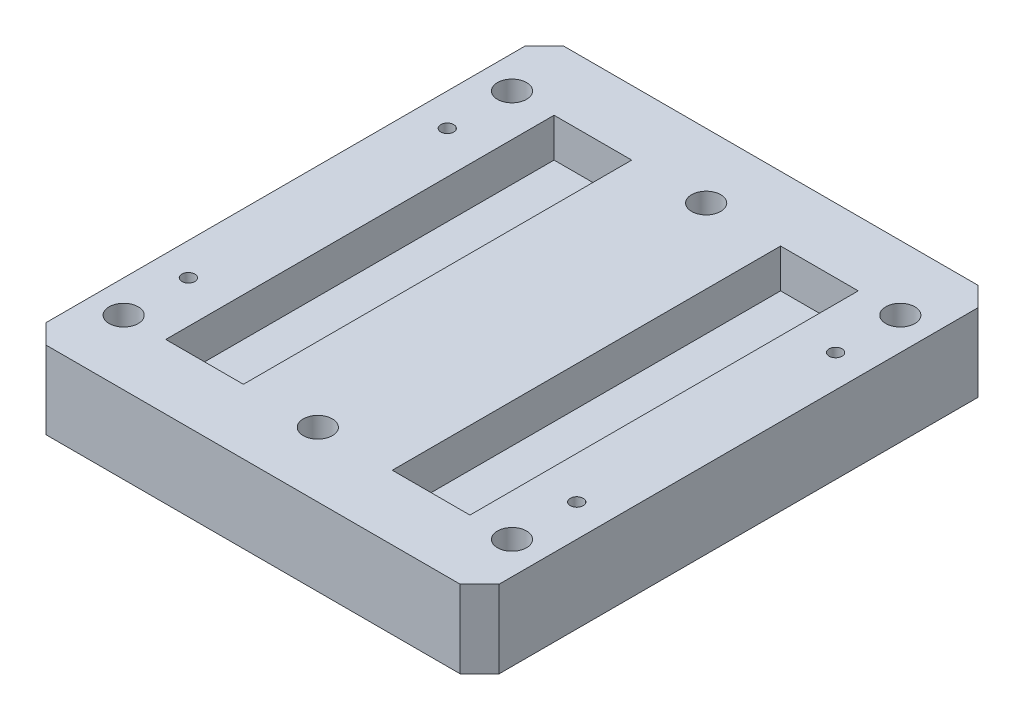
ISO-10303-21;
HEADER;
FILE_DESCRIPTION(('STEP AP214'),'2;1');
FILE_NAME('part.step','',(''),(''),'','','');
FILE_SCHEMA(('AUTOMOTIVE_DESIGN { 1 0 10303 214 1 1 1 1 }'));
ENDSEC;
DATA;
#1=APPLICATION_CONTEXT('core data for automotive mechanical design processes');
#2=APPLICATION_PROTOCOL_DEFINITION('international standard','automotive_design',2000,#1);
#3=PRODUCT_CONTEXT('',#1,'mechanical');
#4=PRODUCT('Part','Part','',(#3));
#5=PRODUCT_RELATED_PRODUCT_CATEGORY('part','',(#4));
#6=PRODUCT_DEFINITION_FORMATION('','',#4);
#7=PRODUCT_DEFINITION_CONTEXT('part definition',#1,'design');
#8=PRODUCT_DEFINITION('design','',#6,#7);
#9=PRODUCT_DEFINITION_SHAPE('','',#8);
#10=(LENGTH_UNIT() NAMED_UNIT(*) SI_UNIT(.MILLI.,.METRE.));
#11=(NAMED_UNIT(*) PLANE_ANGLE_UNIT() SI_UNIT($,.RADIAN.));
#12=(NAMED_UNIT(*) SI_UNIT($,.STERADIAN.) SOLID_ANGLE_UNIT());
#13=UNCERTAINTY_MEASURE_WITH_UNIT(LENGTH_MEASURE(1.E-05),#10,'distance_accuracy_value','');
#14=(GEOMETRIC_REPRESENTATION_CONTEXT(3) GLOBAL_UNCERTAINTY_ASSIGNED_CONTEXT((#13)) GLOBAL_UNIT_ASSIGNED_CONTEXT((#10,
#11,#12)) REPRESENTATION_CONTEXT('',''));
#15=CARTESIAN_POINT('',(0.,0.,0.));
#16=DIRECTION('',(0.,0.,1.));
#17=DIRECTION('',(1.,0.,0.));
#18=AXIS2_PLACEMENT_3D('',#15,#16,#17);
#19=CARTESIAN_POINT('',(0.,0.,80.));
#20=DIRECTION('',(1.,0.,0.));
#21=DIRECTION('',(0.,0.,-1.));
#22=AXIS2_PLACEMENT_3D('',#19,#20,#21);
#23=PLANE('',#22);
#24=DIRECTION('',(0.,0.,-1.));
#25=VECTOR('',#24,1.);
#26=CARTESIAN_POINT('',(0.,12.,80.));
#27=LINE('',#26,#25);
#28=CARTESIAN_POINT('',(0.,12.,77.));
#29=VERTEX_POINT('',#28);
#30=CARTESIAN_POINT('',(0.,12.,3.));
#31=VERTEX_POINT('',#30);
#32=EDGE_CURVE('E271',#29,#31,#27,.T.);
#33=ORIENTED_EDGE('',*,*,#32,.T.);
#34=DIRECTION('',(0.,-1.,0.));
#35=VECTOR('',#34,1.);
#36=CARTESIAN_POINT('',(0.,0.,3.));
#37=LINE('',#36,#35);
#38=CARTESIAN_POINT('',(0.,0.,3.));
#39=VERTEX_POINT('',#38);
#40=EDGE_CURVE('E288',#31,#39,#37,.T.);
#41=ORIENTED_EDGE('',*,*,#40,.T.);
#42=DIRECTION('',(0.,0.,-1.));
#43=VECTOR('',#42,1.);
#44=CARTESIAN_POINT('',(0.,0.,80.));
#45=LINE('',#44,#43);
#46=CARTESIAN_POINT('',(0.,0.,77.));
#47=VERTEX_POINT('',#46);
#48=EDGE_CURVE('E283',#47,#39,#45,.T.);
#49=ORIENTED_EDGE('',*,*,#48,.F.);
#50=DIRECTION('',(0.,1.,0.));
#51=VECTOR('',#50,1.);
#52=CARTESIAN_POINT('',(0.,0.,77.));
#53=LINE('',#52,#51);
#54=EDGE_CURVE('E286',#47,#29,#53,.T.);
#55=ORIENTED_EDGE('',*,*,#54,.T.);
#56=EDGE_LOOP('',(#33,#41,#49,#55));
#57=FACE_BOUND('',#56,.T.);
#58=ADVANCED_FACE('F33',(#57),#23,.F.);
#59=CARTESIAN_POINT('',(0.,0.,80.));
#60=DIRECTION('',(0.,1.,0.));
#61=DIRECTION('',(0.,0.,1.));
#62=AXIS2_PLACEMENT_3D('',#59,#60,#61);
#63=PLANE('',#62);
#64=CARTESIAN_POINT('',(65.,0.,20.));
#65=DIRECTION('',(0.,1.,0.));
#66=DIRECTION('',(0.,0.,-1.));
#67=AXIS2_PLACEMENT_3D('',#64,#65,#66);
#68=CIRCLE('',#67,0.999999999999998);
#69=CARTESIAN_POINT('',(65.,0.,19.));
#70=VERTEX_POINT('',#69);
#71=EDGE_CURVE('E574',#70,#70,#68,.T.);
#72=ORIENTED_EDGE('',*,*,#71,.T.);
#73=EDGE_LOOP('',(#72));
#74=FACE_BOUND('',#73,.T.);
#75=CARTESIAN_POINT('',(65.,0.,60.));
#76=DIRECTION('',(0.,1.,0.));
#77=DIRECTION('',(0.,0.,1.));
#78=AXIS2_PLACEMENT_3D('',#75,#76,#77);
#79=CIRCLE('',#78,0.999999999999998);
#80=CARTESIAN_POINT('',(65.,0.,61.));
#81=VERTEX_POINT('',#80);
#82=EDGE_CURVE('E582',#81,#81,#79,.T.);
#83=ORIENTED_EDGE('',*,*,#82,.T.);
#84=EDGE_LOOP('',(#83));
#85=FACE_BOUND('',#84,.T.);
#86=CARTESIAN_POINT('',(5.,0.,60.));
#87=DIRECTION('',(0.,1.,0.));
#88=DIRECTION('',(0.,0.,-1.));
#89=AXIS2_PLACEMENT_3D('',#86,#87,#88);
#90=CIRCLE('',#89,1.);
#91=CARTESIAN_POINT('',(5.,0.,59.));
#92=VERTEX_POINT('',#91);
#93=EDGE_CURVE('E588',#92,#92,#90,.T.);
#94=ORIENTED_EDGE('',*,*,#93,.T.);
#95=EDGE_LOOP('',(#94));
#96=FACE_BOUND('',#95,.T.);
#97=CARTESIAN_POINT('',(5.,0.,20.));
#98=DIRECTION('',(0.,1.,0.));
#99=DIRECTION('',(0.,0.,1.));
#100=AXIS2_PLACEMENT_3D('',#97,#98,#99);
#101=CIRCLE('',#100,1.);
#102=CARTESIAN_POINT('',(5.,0.,21.));
#103=VERTEX_POINT('',#102);
#104=EDGE_CURVE('E173',#103,#103,#101,.T.);
#105=ORIENTED_EDGE('',*,*,#104,.T.);
#106=EDGE_LOOP('',(#105));
#107=FACE_BOUND('',#106,.T.);
#108=CARTESIAN_POINT('',(35.,0.,70.));
#109=DIRECTION('',(0.,1.,0.));
#110=DIRECTION('',(0.,0.,1.));
#111=AXIS2_PLACEMENT_3D('',#108,#109,#110);
#112=CIRCLE('',#111,2.25);
#113=CARTESIAN_POINT('',(35.,0.,72.25));
#114=VERTEX_POINT('',#113);
#115=EDGE_CURVE('E216',#114,#114,#112,.T.);
#116=ORIENTED_EDGE('',*,*,#115,.T.);
#117=EDGE_LOOP('',(#116));
#118=FACE_BOUND('',#117,.T.);
#119=CARTESIAN_POINT('',(35.,0.,10.));
#120=DIRECTION('',(0.,1.,0.));
#121=DIRECTION('',(0.,0.,1.));
#122=AXIS2_PLACEMENT_3D('',#119,#120,#121);
#123=CIRCLE('',#122,2.25);
#124=CARTESIAN_POINT('',(35.,0.,12.25));
#125=VERTEX_POINT('',#124);
#126=EDGE_CURVE('E222',#125,#125,#123,.T.);
#127=ORIENTED_EDGE('',*,*,#126,.T.);
#128=EDGE_LOOP('',(#127));
#129=FACE_BOUND('',#128,.T.);
#130=CARTESIAN_POINT('',(5.,0.,70.));
#131=DIRECTION('',(0.,1.,0.));
#132=DIRECTION('',(0.,0.,-1.));
#133=AXIS2_PLACEMENT_3D('',#130,#131,#132);
#134=CIRCLE('',#133,2.25);
#135=CARTESIAN_POINT('',(5.,0.,67.75));
#136=VERTEX_POINT('',#135);
#137=EDGE_CURVE('E228',#136,#136,#134,.T.);
#138=ORIENTED_EDGE('',*,*,#137,.T.);
#139=EDGE_LOOP('',(#138));
#140=FACE_BOUND('',#139,.T.);
#141=CARTESIAN_POINT('',(65.,0.,10.));
#142=DIRECTION('',(0.,1.,0.));
#143=DIRECTION('',(0.,0.,-1.));
#144=AXIS2_PLACEMENT_3D('',#141,#142,#143);
#145=CIRCLE('',#144,2.25);
#146=CARTESIAN_POINT('',(65.,0.,7.75000000000001));
#147=VERTEX_POINT('',#146);
#148=EDGE_CURVE('E234',#147,#147,#145,.T.);
#149=ORIENTED_EDGE('',*,*,#148,.T.);
#150=EDGE_LOOP('',(#149));
#151=FACE_BOUND('',#150,.T.);
#152=CARTESIAN_POINT('',(65.,0.,70.));
#153=DIRECTION('',(0.,1.,0.));
#154=DIRECTION('',(0.,0.,1.));
#155=AXIS2_PLACEMENT_3D('',#152,#153,#154);
#156=CIRCLE('',#155,2.25);
#157=CARTESIAN_POINT('',(65.,0.,72.25));
#158=VERTEX_POINT('',#157);
#159=EDGE_CURVE('E240',#158,#158,#156,.T.);
#160=ORIENTED_EDGE('',*,*,#159,.T.);
#161=EDGE_LOOP('',(#160));
#162=FACE_BOUND('',#161,.T.);
#163=CARTESIAN_POINT('',(5.,0.,10.));
#164=DIRECTION('',(0.,1.,0.));
#165=DIRECTION('',(0.,0.,1.));
#166=AXIS2_PLACEMENT_3D('',#163,#164,#165);
#167=CIRCLE('',#166,2.25);
#168=CARTESIAN_POINT('',(5.,0.,12.25));
#169=VERTEX_POINT('',#168);
#170=EDGE_CURVE('E246',#169,#169,#167,.T.);
#171=ORIENTED_EDGE('',*,*,#170,.T.);
#172=EDGE_LOOP('',(#171));
#173=FACE_BOUND('',#172,.T.);
#174=ORIENTED_EDGE('',*,*,#48,.T.);
#175=DIRECTION('',(0.707106781186549,0.,-0.707106781186546));
#176=VECTOR('',#175,1.);
#177=CARTESIAN_POINT('',(0.,0.,3.));
#178=LINE('',#177,#176);
#179=CARTESIAN_POINT('',(3.00000000000002,0.,0.));
#180=VERTEX_POINT('',#179);
#181=EDGE_CURVE('E297',#39,#180,#178,.T.);
#182=ORIENTED_EDGE('',*,*,#181,.T.);
#183=DIRECTION('',(1.,0.,0.));
#184=VECTOR('',#183,1.);
#185=CARTESIAN_POINT('',(0.,0.,0.));
#186=LINE('',#185,#184);
#187=CARTESIAN_POINT('',(67.,0.,0.));
#188=VERTEX_POINT('',#187);
#189=EDGE_CURVE('E261',#180,#188,#186,.T.);
#190=ORIENTED_EDGE('',*,*,#189,.T.);
#191=DIRECTION('',(0.707106781186549,0.,0.707106781186546));
#192=VECTOR('',#191,1.);
#193=CARTESIAN_POINT('',(70.,0.,3.));
#194=LINE('',#193,#192);
#195=CARTESIAN_POINT('',(70.,0.,3.));
#196=VERTEX_POINT('',#195);
#197=EDGE_CURVE('E295',#188,#196,#194,.T.);
#198=ORIENTED_EDGE('',*,*,#197,.T.);
#199=DIRECTION('',(0.,0.,-1.));
#200=VECTOR('',#199,1.);
#201=CARTESIAN_POINT('',(70.,0.,80.));
#202=LINE('',#201,#200);
#203=CARTESIAN_POINT('',(70.,0.,77.));
#204=VERTEX_POINT('',#203);
#205=EDGE_CURVE('E280',#204,#196,#202,.T.);
#206=ORIENTED_EDGE('',*,*,#205,.F.);
#207=DIRECTION('',(0.707106781186546,0.,-0.707106781186549));
#208=VECTOR('',#207,1.);
#209=CARTESIAN_POINT('',(67.,0.,80.));
#210=LINE('',#209,#208);
#211=CARTESIAN_POINT('',(67.,0.,80.));
#212=VERTEX_POINT('',#211);
#213=EDGE_CURVE('E293',#204,#212,#210,.F.);
#214=ORIENTED_EDGE('',*,*,#213,.T.);
#215=DIRECTION('',(1.,0.,0.));
#216=VECTOR('',#215,1.);
#217=CARTESIAN_POINT('',(0.,0.,80.));
#218=LINE('',#217,#216);
#219=CARTESIAN_POINT('',(3.,0.,80.));
#220=VERTEX_POINT('',#219);
#221=EDGE_CURVE('E264',#220,#212,#218,.T.);
#222=ORIENTED_EDGE('',*,*,#221,.F.);
#223=DIRECTION('',(0.707106781186546,0.,0.707106781186549));
#224=VECTOR('',#223,1.);
#225=CARTESIAN_POINT('',(3.,0.,80.));
#226=LINE('',#225,#224);
#227=EDGE_CURVE('E291',#220,#47,#226,.F.);
#228=ORIENTED_EDGE('',*,*,#227,.T.);
#229=EDGE_LOOP('',(#174,#182,#190,#198,#206,#214,#222,#228));
#230=FACE_BOUND('',#229,.T.);
#231=ADVANCED_FACE('F321',(#74,#85,#96,#107,#118,#129,#140,#151,#162,#173,#230),#63,.F.);
#232=CARTESIAN_POINT('',(70.,0.,80.));
#233=DIRECTION('',(-1.,0.,0.));
#234=DIRECTION('',(0.,0.,1.));
#235=AXIS2_PLACEMENT_3D('',#232,#233,#234);
#236=PLANE('',#235);
#237=ORIENTED_EDGE('',*,*,#205,.T.);
#238=DIRECTION('',(0.,1.,0.));
#239=VECTOR('',#238,1.);
#240=CARTESIAN_POINT('',(70.,12.,3.));
#241=LINE('',#240,#239);
#242=CARTESIAN_POINT('',(70.,12.,3.));
#243=VERTEX_POINT('',#242);
#244=EDGE_CURVE('E311',#196,#243,#241,.T.);
#245=ORIENTED_EDGE('',*,*,#244,.T.);
#246=DIRECTION('',(0.,0.,-1.));
#247=VECTOR('',#246,1.);
#248=CARTESIAN_POINT('',(70.,12.,80.));
#249=LINE('',#248,#247);
#250=CARTESIAN_POINT('',(70.,12.,77.));
#251=VERTEX_POINT('',#250);
#252=EDGE_CURVE('E278',#251,#243,#249,.T.);
#253=ORIENTED_EDGE('',*,*,#252,.F.);
#254=DIRECTION('',(0.,-1.,0.));
#255=VECTOR('',#254,1.);
#256=CARTESIAN_POINT('',(70.,0.,77.));
#257=LINE('',#256,#255);
#258=EDGE_CURVE('E309',#251,#204,#257,.T.);
#259=ORIENTED_EDGE('',*,*,#258,.T.);
#260=EDGE_LOOP('',(#237,#245,#253,#259));
#261=FACE_BOUND('',#260,.T.);
#262=ADVANCED_FACE('F344',(#261),#236,.F.);
#263=CARTESIAN_POINT('',(0.,12.,80.));
#264=DIRECTION('',(0.,-1.,0.));
#265=DIRECTION('',(0.,0.,-1.));
#266=AXIS2_PLACEMENT_3D('',#263,#264,#265);
#267=PLANE('',#266);
#268=CARTESIAN_POINT('',(65.,12.,20.));
#269=DIRECTION('',(0.,1.,0.));
#270=DIRECTION('',(0.,0.,-1.));
#271=AXIS2_PLACEMENT_3D('',#268,#269,#270);
#272=CIRCLE('',#271,0.999999999999998);
#273=CARTESIAN_POINT('',(65.,12.,19.));
#274=VERTEX_POINT('',#273);
#275=EDGE_CURVE('E577',#274,#274,#272,.T.);
#276=ORIENTED_EDGE('',*,*,#275,.F.);
#277=EDGE_LOOP('',(#276));
#278=FACE_BOUND('',#277,.T.);
#279=CARTESIAN_POINT('',(65.,12.,60.));
#280=DIRECTION('',(0.,1.,0.));
#281=DIRECTION('',(0.,0.,1.));
#282=AXIS2_PLACEMENT_3D('',#279,#280,#281);
#283=CIRCLE('',#282,0.999999999999998);
#284=CARTESIAN_POINT('',(65.,12.,61.));
#285=VERTEX_POINT('',#284);
#286=EDGE_CURVE('E579',#285,#285,#283,.T.);
#287=ORIENTED_EDGE('',*,*,#286,.F.);
#288=EDGE_LOOP('',(#287));
#289=FACE_BOUND('',#288,.T.);
#290=CARTESIAN_POINT('',(5.,12.,60.));
#291=DIRECTION('',(0.,1.,0.));
#292=DIRECTION('',(0.,0.,-1.));
#293=AXIS2_PLACEMENT_3D('',#290,#291,#292);
#294=CIRCLE('',#293,1.);
#295=CARTESIAN_POINT('',(5.,12.,59.));
#296=VERTEX_POINT('',#295);
#297=EDGE_CURVE('E585',#296,#296,#294,.T.);
#298=ORIENTED_EDGE('',*,*,#297,.F.);
#299=EDGE_LOOP('',(#298));
#300=FACE_BOUND('',#299,.T.);
#301=CARTESIAN_POINT('',(5.,12.,20.));
#302=DIRECTION('',(0.,1.,0.));
#303=DIRECTION('',(0.,0.,1.));
#304=AXIS2_PLACEMENT_3D('',#301,#302,#303);
#305=CIRCLE('',#304,1.);
#306=CARTESIAN_POINT('',(5.,12.,21.));
#307=VERTEX_POINT('',#306);
#308=EDGE_CURVE('E177',#307,#307,#305,.T.);
#309=ORIENTED_EDGE('',*,*,#308,.F.);
#310=EDGE_LOOP('',(#309));
#311=FACE_BOUND('',#310,.T.);
#312=DIRECTION('',(1.,0.,0.));
#313=VECTOR('',#312,1.);
#314=CARTESIAN_POINT('',(11.5,12.,9.99999999999999));
#315=LINE('',#314,#313);
#316=CARTESIAN_POINT('',(11.5,12.,9.99999999999999));
#317=VERTEX_POINT('',#316);
#318=CARTESIAN_POINT('',(23.5,12.,9.99999999999999));
#319=VERTEX_POINT('',#318);
#320=EDGE_CURVE('E153',#317,#319,#315,.T.);
#321=ORIENTED_EDGE('',*,*,#320,.T.);
#322=DIRECTION('',(0.,0.,1.));
#323=VECTOR('',#322,1.);
#324=CARTESIAN_POINT('',(23.5,12.,0.));
#325=LINE('',#324,#323);
#326=CARTESIAN_POINT('',(23.5,12.,70.));
#327=VERTEX_POINT('',#326);
#328=EDGE_CURVE('E160',#319,#327,#325,.T.);
#329=ORIENTED_EDGE('',*,*,#328,.T.);
#330=DIRECTION('',(-1.,0.,0.));
#331=VECTOR('',#330,1.);
#332=CARTESIAN_POINT('',(11.5,12.,70.));
#333=LINE('',#332,#331);
#334=CARTESIAN_POINT('',(11.5,12.,70.));
#335=VERTEX_POINT('',#334);
#336=EDGE_CURVE('E155',#327,#335,#333,.T.);
#337=ORIENTED_EDGE('',*,*,#336,.T.);
#338=DIRECTION('',(0.,0.,1.));
#339=VECTOR('',#338,1.);
#340=CARTESIAN_POINT('',(11.5,12.,0.));
#341=LINE('',#340,#339);
#342=EDGE_CURVE('E148',#317,#335,#341,.T.);
#343=ORIENTED_EDGE('',*,*,#342,.F.);
#344=EDGE_LOOP('',(#321,#329,#337,#343));
#345=FACE_BOUND('',#344,.T.);
#346=DIRECTION('',(1.,0.,0.));
#347=VECTOR('',#346,1.);
#348=CARTESIAN_POINT('',(58.5,12.,9.99999999999999));
#349=LINE('',#348,#347);
#350=CARTESIAN_POINT('',(46.5,12.,9.99999999999999));
#351=VERTEX_POINT('',#350);
#352=CARTESIAN_POINT('',(58.5,12.,9.99999999999999));
#353=VERTEX_POINT('',#352);
#354=EDGE_CURVE('E181',#351,#353,#349,.T.);
#355=ORIENTED_EDGE('',*,*,#354,.T.);
#356=DIRECTION('',(0.,0.,1.));
#357=VECTOR('',#356,1.);
#358=CARTESIAN_POINT('',(58.5,12.,0.));
#359=LINE('',#358,#357);
#360=CARTESIAN_POINT('',(58.5,12.,70.));
#361=VERTEX_POINT('',#360);
#362=EDGE_CURVE('E252',#353,#361,#359,.T.);
#363=ORIENTED_EDGE('',*,*,#362,.T.);
#364=DIRECTION('',(-1.,0.,0.));
#365=VECTOR('',#364,1.);
#366=CARTESIAN_POINT('',(58.5,12.,70.));
#367=LINE('',#366,#365);
#368=CARTESIAN_POINT('',(46.5,12.,70.));
#369=VERTEX_POINT('',#368);
#370=EDGE_CURVE('E192',#361,#369,#367,.T.);
#371=ORIENTED_EDGE('',*,*,#370,.T.);
#372=DIRECTION('',(0.,0.,1.));
#373=VECTOR('',#372,1.);
#374=CARTESIAN_POINT('',(46.5,12.,0.));
#375=LINE('',#374,#373);
#376=EDGE_CURVE('E249',#351,#369,#375,.T.);
#377=ORIENTED_EDGE('',*,*,#376,.F.);
#378=EDGE_LOOP('',(#355,#363,#371,#377));
#379=FACE_BOUND('',#378,.T.);
#380=CARTESIAN_POINT('',(5.,12.,70.));
#381=DIRECTION('',(0.,1.,0.));
#382=DIRECTION('',(0.,0.,-1.));
#383=AXIS2_PLACEMENT_3D('',#380,#381,#382);
#384=CIRCLE('',#383,2.25);
#385=CARTESIAN_POINT('',(5.,12.,67.75));
#386=VERTEX_POINT('',#385);
#387=EDGE_CURVE('E225',#386,#386,#384,.T.);
#388=ORIENTED_EDGE('',*,*,#387,.F.);
#389=EDGE_LOOP('',(#388));
#390=FACE_BOUND('',#389,.T.);
#391=CARTESIAN_POINT('',(5.,12.,10.));
#392=DIRECTION('',(0.,1.,0.));
#393=DIRECTION('',(0.,0.,1.));
#394=AXIS2_PLACEMENT_3D('',#391,#392,#393);
#395=CIRCLE('',#394,2.25);
#396=CARTESIAN_POINT('',(5.,12.,12.25));
#397=VERTEX_POINT('',#396);
#398=EDGE_CURVE('E243',#397,#397,#395,.T.);
#399=ORIENTED_EDGE('',*,*,#398,.F.);
#400=EDGE_LOOP('',(#399));
#401=FACE_BOUND('',#400,.T.);
#402=DIRECTION('',(-1.,0.,0.));
#403=VECTOR('',#402,1.);
#404=CARTESIAN_POINT('',(0.,12.,0.));
#405=LINE('',#404,#403);
#406=CARTESIAN_POINT('',(67.,12.,0.));
#407=VERTEX_POINT('',#406);
#408=CARTESIAN_POINT('',(3.00000000000002,12.,0.));
#409=VERTEX_POINT('',#408);
#410=EDGE_CURVE('E268',#407,#409,#405,.T.);
#411=ORIENTED_EDGE('',*,*,#410,.T.);
#412=DIRECTION('',(-0.707106781186549,0.,0.707106781186546));
#413=VECTOR('',#412,1.);
#414=CARTESIAN_POINT('',(0.,12.,3.));
#415=LINE('',#414,#413);
#416=EDGE_CURVE('E307',#409,#31,#415,.T.);
#417=ORIENTED_EDGE('',*,*,#416,.T.);
#418=ORIENTED_EDGE('',*,*,#32,.F.);
#419=DIRECTION('',(-0.707106781186546,0.,-0.707106781186549));
#420=VECTOR('',#419,1.);
#421=CARTESIAN_POINT('',(3.,12.,80.));
#422=LINE('',#421,#420);
#423=CARTESIAN_POINT('',(3.,12.,80.));
#424=VERTEX_POINT('',#423);
#425=EDGE_CURVE('E303',#29,#424,#422,.F.);
#426=ORIENTED_EDGE('',*,*,#425,.T.);
#427=DIRECTION('',(-1.,0.,0.));
#428=VECTOR('',#427,1.);
#429=CARTESIAN_POINT('',(0.,12.,80.));
#430=LINE('',#429,#428);
#431=CARTESIAN_POINT('',(67.,12.,80.));
#432=VERTEX_POINT('',#431);
#433=EDGE_CURVE('E267',#432,#424,#430,.T.);
#434=ORIENTED_EDGE('',*,*,#433,.F.);
#435=DIRECTION('',(-0.707106781186546,0.,0.707106781186549));
#436=VECTOR('',#435,1.);
#437=CARTESIAN_POINT('',(67.,12.,80.));
#438=LINE('',#437,#436);
#439=EDGE_CURVE('E56',#432,#251,#438,.F.);
#440=ORIENTED_EDGE('',*,*,#439,.T.);
#441=ORIENTED_EDGE('',*,*,#252,.T.);
#442=DIRECTION('',(-0.707106781186549,0.,-0.707106781186546));
#443=VECTOR('',#442,1.);
#444=CARTESIAN_POINT('',(70.,12.,3.));
#445=LINE('',#444,#443);
#446=EDGE_CURVE('E48',#243,#407,#445,.T.);
#447=ORIENTED_EDGE('',*,*,#446,.T.);
#448=EDGE_LOOP('',(#411,#417,#418,#426,#434,#440,#441,#447));
#449=FACE_BOUND('',#448,.T.);
#450=CARTESIAN_POINT('',(35.,12.,70.));
#451=DIRECTION('',(0.,1.,0.));
#452=DIRECTION('',(0.,0.,1.));
#453=AXIS2_PLACEMENT_3D('',#450,#451,#452);
#454=CIRCLE('',#453,2.25);
#455=CARTESIAN_POINT('',(35.,12.,72.25));
#456=VERTEX_POINT('',#455);
#457=EDGE_CURVE('E213',#456,#456,#454,.T.);
#458=ORIENTED_EDGE('',*,*,#457,.F.);
#459=EDGE_LOOP('',(#458));
#460=FACE_BOUND('',#459,.T.);
#461=CARTESIAN_POINT('',(35.,12.,10.));
#462=DIRECTION('',(0.,1.,0.));
#463=DIRECTION('',(0.,0.,1.));
#464=AXIS2_PLACEMENT_3D('',#461,#462,#463);
#465=CIRCLE('',#464,2.25);
#466=CARTESIAN_POINT('',(35.,12.,12.25));
#467=VERTEX_POINT('',#466);
#468=EDGE_CURVE('E219',#467,#467,#465,.T.);
#469=ORIENTED_EDGE('',*,*,#468,.F.);
#470=EDGE_LOOP('',(#469));
#471=FACE_BOUND('',#470,.T.);
#472=CARTESIAN_POINT('',(65.,12.,10.));
#473=DIRECTION('',(0.,1.,0.));
#474=DIRECTION('',(0.,0.,-1.));
#475=AXIS2_PLACEMENT_3D('',#472,#473,#474);
#476=CIRCLE('',#475,2.25);
#477=CARTESIAN_POINT('',(65.,12.,7.75000000000001));
#478=VERTEX_POINT('',#477);
#479=EDGE_CURVE('E231',#478,#478,#476,.T.);
#480=ORIENTED_EDGE('',*,*,#479,.F.);
#481=EDGE_LOOP('',(#480));
#482=FACE_BOUND('',#481,.T.);
#483=CARTESIAN_POINT('',(65.,12.,70.));
#484=DIRECTION('',(0.,1.,0.));
#485=DIRECTION('',(0.,0.,1.));
#486=AXIS2_PLACEMENT_3D('',#483,#484,#485);
#487=CIRCLE('',#486,2.25);
#488=CARTESIAN_POINT('',(65.,12.,72.25));
#489=VERTEX_POINT('',#488);
#490=EDGE_CURVE('E237',#489,#489,#487,.T.);
#491=ORIENTED_EDGE('',*,*,#490,.F.);
#492=EDGE_LOOP('',(#491));
#493=FACE_BOUND('',#492,.T.);
#494=ADVANCED_FACE('F150',(#278,#289,#300,#311,#345,#379,#390,#401,#449,#460,#471,#482,#493),
#267,.F.);
#495=CARTESIAN_POINT('',(0.,0.,80.));
#496=DIRECTION('',(0.,0.,-1.));
#497=DIRECTION('',(-1.,0.,0.));
#498=AXIS2_PLACEMENT_3D('',#495,#496,#497);
#499=PLANE('',#498);
#500=ORIENTED_EDGE('',*,*,#221,.T.);
#501=DIRECTION('',(0.,1.,0.));
#502=VECTOR('',#501,1.);
#503=CARTESIAN_POINT('',(67.,0.,80.));
#504=LINE('',#503,#502);
#505=EDGE_CURVE('E11',#212,#432,#504,.T.);
#506=ORIENTED_EDGE('',*,*,#505,.T.);
#507=ORIENTED_EDGE('',*,*,#433,.T.);
#508=DIRECTION('',(0.,-1.,0.));
#509=VECTOR('',#508,1.);
#510=CARTESIAN_POINT('',(3.,0.,80.));
#511=LINE('',#510,#509);
#512=EDGE_CURVE('E41',#424,#220,#511,.T.);
#513=ORIENTED_EDGE('',*,*,#512,.T.);
#514=EDGE_LOOP('',(#500,#506,#507,#513));
#515=FACE_BOUND('',#514,.T.);
#516=ADVANCED_FACE('F316',(#515),#499,.F.);
#517=CARTESIAN_POINT('',(0.,0.,0.));
#518=DIRECTION('',(0.,0.,-1.));
#519=DIRECTION('',(-1.,0.,0.));
#520=AXIS2_PLACEMENT_3D('',#517,#518,#519);
#521=PLANE('',#520);
#522=ORIENTED_EDGE('',*,*,#189,.F.);
#523=DIRECTION('',(0.,1.,0.));
#524=VECTOR('',#523,1.);
#525=CARTESIAN_POINT('',(3.00000000000002,12.,0.));
#526=LINE('',#525,#524);
#527=EDGE_CURVE('E301',#180,#409,#526,.T.);
#528=ORIENTED_EDGE('',*,*,#527,.T.);
#529=ORIENTED_EDGE('',*,*,#410,.F.);
#530=DIRECTION('',(0.,-1.,0.));
#531=VECTOR('',#530,1.);
#532=CARTESIAN_POINT('',(67.,0.,0.));
#533=LINE('',#532,#531);
#534=EDGE_CURVE('E299',#407,#188,#533,.T.);
#535=ORIENTED_EDGE('',*,*,#534,.T.);
#536=EDGE_LOOP('',(#522,#528,#529,#535));
#537=FACE_BOUND('',#536,.T.);
#538=ADVANCED_FACE('F338',(#537),#521,.T.);
#539=CARTESIAN_POINT('',(23.5,12.,0.));
#540=DIRECTION('',(1.,0.,0.));
#541=DIRECTION('',(0.,1.,0.));
#542=AXIS2_PLACEMENT_3D('',#539,#540,#541);
#543=PLANE('',#542);
#544=ORIENTED_EDGE('',*,*,#328,.F.);
#545=DIRECTION('',(0.,1.,0.));
#546=VECTOR('',#545,1.);
#547=CARTESIAN_POINT('',(23.5,6.,9.99999999999999));
#548=LINE('',#547,#546);
#549=CARTESIAN_POINT('',(23.5,6.,9.99999999999999));
#550=VERTEX_POINT('',#549);
#551=EDGE_CURVE('E168',#550,#319,#548,.T.);
#552=ORIENTED_EDGE('',*,*,#551,.F.);
#553=DIRECTION('',(0.,0.,1.));
#554=VECTOR('',#553,1.);
#555=CARTESIAN_POINT('',(23.5,6.,0.));
#556=LINE('',#555,#554);
#557=CARTESIAN_POINT('',(23.5,6.,70.));
#558=VERTEX_POINT('',#557);
#559=EDGE_CURVE('E259',#550,#558,#556,.T.);
#560=ORIENTED_EDGE('',*,*,#559,.T.);
#561=DIRECTION('',(0.,1.,0.));
#562=VECTOR('',#561,1.);
#563=CARTESIAN_POINT('',(23.5,6.,70.));
#564=LINE('',#563,#562);
#565=EDGE_CURVE('E209',#558,#327,#564,.T.);
#566=ORIENTED_EDGE('',*,*,#565,.T.);
#567=EDGE_LOOP('',(#544,#552,#560,#566));
#568=FACE_BOUND('',#567,.T.);
#569=ADVANCED_FACE('F439',(#568),#543,.F.);
#570=CARTESIAN_POINT('',(23.5,6.,0.));
#571=DIRECTION('',(0.,-1.,0.));
#572=DIRECTION('',(1.,0.,0.));
#573=AXIS2_PLACEMENT_3D('',#570,#571,#572);
#574=PLANE('',#573);
#575=ORIENTED_EDGE('',*,*,#559,.F.);
#576=DIRECTION('',(1.,0.,0.));
#577=VECTOR('',#576,1.);
#578=CARTESIAN_POINT('',(11.5,6.,9.99999999999999));
#579=LINE('',#578,#577);
#580=CARTESIAN_POINT('',(11.5,6.,9.99999999999999));
#581=VERTEX_POINT('',#580);
#582=EDGE_CURVE('E169',#581,#550,#579,.T.);
#583=ORIENTED_EDGE('',*,*,#582,.F.);
#584=DIRECTION('',(0.,0.,1.));
#585=VECTOR('',#584,1.);
#586=CARTESIAN_POINT('',(11.5,6.,0.));
#587=LINE('',#586,#585);
#588=CARTESIAN_POINT('',(11.5,6.,70.));
#589=VERTEX_POINT('',#588);
#590=EDGE_CURVE('E159',#581,#589,#587,.T.);
#591=ORIENTED_EDGE('',*,*,#590,.T.);
#592=DIRECTION('',(-1.,0.,0.));
#593=VECTOR('',#592,1.);
#594=CARTESIAN_POINT('',(11.5,6.,70.));
#595=LINE('',#594,#593);
#596=EDGE_CURVE('E206',#558,#589,#595,.T.);
#597=ORIENTED_EDGE('',*,*,#596,.F.);
#598=EDGE_LOOP('',(#575,#583,#591,#597));
#599=FACE_BOUND('',#598,.T.);
#600=ADVANCED_FACE('F436',(#599),#574,.F.);
#601=CARTESIAN_POINT('',(11.5,12.,0.));
#602=DIRECTION('',(-1.,0.,0.));
#603=DIRECTION('',(0.,0.,1.));
#604=AXIS2_PLACEMENT_3D('',#601,#602,#603);
#605=PLANE('',#604);
#606=ORIENTED_EDGE('',*,*,#590,.F.);
#607=DIRECTION('',(0.,1.,0.));
#608=VECTOR('',#607,1.);
#609=CARTESIAN_POINT('',(11.5,6.,9.99999999999999));
#610=LINE('',#609,#608);
#611=EDGE_CURVE('E164',#581,#317,#610,.T.);
#612=ORIENTED_EDGE('',*,*,#611,.T.);
#613=ORIENTED_EDGE('',*,*,#342,.T.);
#614=DIRECTION('',(0.,1.,0.));
#615=VECTOR('',#614,1.);
#616=CARTESIAN_POINT('',(11.5,6.,70.));
#617=LINE('',#616,#615);
#618=EDGE_CURVE('E211',#589,#335,#617,.T.);
#619=ORIENTED_EDGE('',*,*,#618,.F.);
#620=EDGE_LOOP('',(#606,#612,#613,#619));
#621=FACE_BOUND('',#620,.T.);
#622=ADVANCED_FACE('F165',(#621),#605,.F.);
#623=CARTESIAN_POINT('',(58.5,12.,0.));
#624=DIRECTION('',(1.,0.,0.));
#625=DIRECTION('',(0.,0.,-1.));
#626=AXIS2_PLACEMENT_3D('',#623,#624,#625);
#627=PLANE('',#626);
#628=ORIENTED_EDGE('',*,*,#362,.F.);
#629=DIRECTION('',(0.,1.,0.));
#630=VECTOR('',#629,1.);
#631=CARTESIAN_POINT('',(58.5,6.,9.99999999999999));
#632=LINE('',#631,#630);
#633=CARTESIAN_POINT('',(58.5,6.,9.99999999999999));
#634=VERTEX_POINT('',#633);
#635=EDGE_CURVE('E189',#634,#353,#632,.T.);
#636=ORIENTED_EDGE('',*,*,#635,.F.);
#637=DIRECTION('',(0.,0.,1.));
#638=VECTOR('',#637,1.);
#639=CARTESIAN_POINT('',(58.5,6.,0.));
#640=LINE('',#639,#638);
#641=CARTESIAN_POINT('',(58.5,6.,70.));
#642=VERTEX_POINT('',#641);
#643=EDGE_CURVE('E254',#634,#642,#640,.T.);
#644=ORIENTED_EDGE('',*,*,#643,.T.);
#645=DIRECTION('',(0.,1.,0.));
#646=VECTOR('',#645,1.);
#647=CARTESIAN_POINT('',(58.5,6.,70.));
#648=LINE('',#647,#646);
#649=EDGE_CURVE('E198',#642,#361,#648,.T.);
#650=ORIENTED_EDGE('',*,*,#649,.T.);
#651=EDGE_LOOP('',(#628,#636,#644,#650));
#652=FACE_BOUND('',#651,.T.);
#653=ADVANCED_FACE('F425',(#652),#627,.F.);
#654=CARTESIAN_POINT('',(46.5,6.,0.));
#655=DIRECTION('',(0.,-1.,0.));
#656=DIRECTION('',(1.,0.,0.));
#657=AXIS2_PLACEMENT_3D('',#654,#655,#656);
#658=PLANE('',#657);
#659=ORIENTED_EDGE('',*,*,#643,.F.);
#660=DIRECTION('',(1.,0.,0.));
#661=VECTOR('',#660,1.);
#662=CARTESIAN_POINT('',(58.5,6.,9.99999999999999));
#663=LINE('',#662,#661);
#664=CARTESIAN_POINT('',(46.5,6.,9.99999999999999));
#665=VERTEX_POINT('',#664);
#666=EDGE_CURVE('E183',#665,#634,#663,.T.);
#667=ORIENTED_EDGE('',*,*,#666,.F.);
#668=DIRECTION('',(0.,0.,1.));
#669=VECTOR('',#668,1.);
#670=CARTESIAN_POINT('',(46.5,6.,0.));
#671=LINE('',#670,#669);
#672=CARTESIAN_POINT('',(46.5,6.,70.));
#673=VERTEX_POINT('',#672);
#674=EDGE_CURVE('E256',#665,#673,#671,.T.);
#675=ORIENTED_EDGE('',*,*,#674,.T.);
#676=DIRECTION('',(-1.,0.,0.));
#677=VECTOR('',#676,1.);
#678=CARTESIAN_POINT('',(58.5,6.,70.));
#679=LINE('',#678,#677);
#680=EDGE_CURVE('E195',#642,#673,#679,.T.);
#681=ORIENTED_EDGE('',*,*,#680,.F.);
#682=EDGE_LOOP('',(#659,#667,#675,#681));
#683=FACE_BOUND('',#682,.T.);
#684=ADVANCED_FACE('F428',(#683),#658,.F.);
#685=CARTESIAN_POINT('',(46.5,12.,0.));
#686=DIRECTION('',(-1.,0.,0.));
#687=DIRECTION('',(0.,0.,1.));
#688=AXIS2_PLACEMENT_3D('',#685,#686,#687);
#689=PLANE('',#688);
#690=ORIENTED_EDGE('',*,*,#674,.F.);
#691=DIRECTION('',(0.,1.,0.));
#692=VECTOR('',#691,1.);
#693=CARTESIAN_POINT('',(46.5,6.,9.99999999999999));
#694=LINE('',#693,#692);
#695=EDGE_CURVE('E186',#665,#351,#694,.T.);
#696=ORIENTED_EDGE('',*,*,#695,.T.);
#697=ORIENTED_EDGE('',*,*,#376,.T.);
#698=DIRECTION('',(0.,1.,0.));
#699=VECTOR('',#698,1.);
#700=CARTESIAN_POINT('',(46.5,6.,70.));
#701=LINE('',#700,#699);
#702=EDGE_CURVE('E201',#673,#369,#701,.T.);
#703=ORIENTED_EDGE('',*,*,#702,.F.);
#704=EDGE_LOOP('',(#690,#696,#697,#703));
#705=FACE_BOUND('',#704,.T.);
#706=ADVANCED_FACE('F423',(#705),#689,.F.);
#707=CARTESIAN_POINT('',(5.,0.,10.));
#708=DIRECTION('',(0.,1.,0.));
#709=DIRECTION('',(0.,0.,1.));
#710=AXIS2_PLACEMENT_3D('',#707,#708,#709);
#711=CYLINDRICAL_SURFACE('',#710,2.25);
#712=ORIENTED_EDGE('',*,*,#170,.F.);
#713=EDGE_LOOP('',(#712));
#714=FACE_BOUND('',#713,.T.);
#715=ORIENTED_EDGE('',*,*,#398,.T.);
#716=EDGE_LOOP('',(#715));
#717=FACE_BOUND('',#716,.T.);
#718=ADVANCED_FACE('F419',(#714,#717),#711,.F.);
#719=CARTESIAN_POINT('',(65.,0.,70.));
#720=DIRECTION('',(0.,1.,0.));
#721=DIRECTION('',(0.,0.,1.));
#722=AXIS2_PLACEMENT_3D('',#719,#720,#721);
#723=CYLINDRICAL_SURFACE('',#722,2.25);
#724=ORIENTED_EDGE('',*,*,#159,.F.);
#725=EDGE_LOOP('',(#724));
#726=FACE_BOUND('',#725,.T.);
#727=ORIENTED_EDGE('',*,*,#490,.T.);
#728=EDGE_LOOP('',(#727));
#729=FACE_BOUND('',#728,.T.);
#730=ADVANCED_FACE('F415',(#726,#729),#723,.F.);
#731=CARTESIAN_POINT('',(65.,0.,10.));
#732=DIRECTION('',(0.,1.,0.));
#733=DIRECTION('',(0.,0.,1.));
#734=AXIS2_PLACEMENT_3D('',#731,#732,#733);
#735=CYLINDRICAL_SURFACE('',#734,2.25);
#736=ORIENTED_EDGE('',*,*,#148,.F.);
#737=EDGE_LOOP('',(#736));
#738=FACE_BOUND('',#737,.T.);
#739=ORIENTED_EDGE('',*,*,#479,.T.);
#740=EDGE_LOOP('',(#739));
#741=FACE_BOUND('',#740,.T.);
#742=ADVANCED_FACE('F411',(#738,#741),#735,.F.);
#743=CARTESIAN_POINT('',(5.,0.,70.));
#744=DIRECTION('',(0.,1.,0.));
#745=DIRECTION('',(0.,0.,1.));
#746=AXIS2_PLACEMENT_3D('',#743,#744,#745);
#747=CYLINDRICAL_SURFACE('',#746,2.25);
#748=ORIENTED_EDGE('',*,*,#137,.F.);
#749=EDGE_LOOP('',(#748));
#750=FACE_BOUND('',#749,.T.);
#751=ORIENTED_EDGE('',*,*,#387,.T.);
#752=EDGE_LOOP('',(#751));
#753=FACE_BOUND('',#752,.T.);
#754=ADVANCED_FACE('F407',(#750,#753),#747,.F.);
#755=CARTESIAN_POINT('',(35.,0.,10.));
#756=DIRECTION('',(0.,1.,0.));
#757=DIRECTION('',(0.,0.,1.));
#758=AXIS2_PLACEMENT_3D('',#755,#756,#757);
#759=CYLINDRICAL_SURFACE('',#758,2.25);
#760=ORIENTED_EDGE('',*,*,#126,.F.);
#761=EDGE_LOOP('',(#760));
#762=FACE_BOUND('',#761,.T.);
#763=ORIENTED_EDGE('',*,*,#468,.T.);
#764=EDGE_LOOP('',(#763));
#765=FACE_BOUND('',#764,.T.);
#766=ADVANCED_FACE('F403',(#762,#765),#759,.F.);
#767=CARTESIAN_POINT('',(35.,0.,70.));
#768=DIRECTION('',(0.,1.,0.));
#769=DIRECTION('',(0.,0.,1.));
#770=AXIS2_PLACEMENT_3D('',#767,#768,#769);
#771=CYLINDRICAL_SURFACE('',#770,2.25);
#772=ORIENTED_EDGE('',*,*,#115,.F.);
#773=EDGE_LOOP('',(#772));
#774=FACE_BOUND('',#773,.T.);
#775=ORIENTED_EDGE('',*,*,#457,.T.);
#776=EDGE_LOOP('',(#775));
#777=FACE_BOUND('',#776,.T.);
#778=ADVANCED_FACE('F399',(#774,#777),#771,.F.);
#779=CARTESIAN_POINT('',(11.5,6.,70.));
#780=DIRECTION('',(0.,0.,-1.));
#781=DIRECTION('',(-1.,0.,0.));
#782=AXIS2_PLACEMENT_3D('',#779,#780,#781);
#783=PLANE('',#782);
#784=ORIENTED_EDGE('',*,*,#336,.F.);
#785=ORIENTED_EDGE('',*,*,#565,.F.);
#786=ORIENTED_EDGE('',*,*,#596,.T.);
#787=ORIENTED_EDGE('',*,*,#618,.T.);
#788=EDGE_LOOP('',(#784,#785,#786,#787));
#789=FACE_BOUND('',#788,.T.);
#790=ADVANCED_FACE('F395',(#789),#783,.T.);
#791=CARTESIAN_POINT('',(58.5,6.,70.));
#792=DIRECTION('',(0.,0.,-1.));
#793=DIRECTION('',(-1.,0.,0.));
#794=AXIS2_PLACEMENT_3D('',#791,#792,#793);
#795=PLANE('',#794);
#796=ORIENTED_EDGE('',*,*,#370,.F.);
#797=ORIENTED_EDGE('',*,*,#649,.F.);
#798=ORIENTED_EDGE('',*,*,#680,.T.);
#799=ORIENTED_EDGE('',*,*,#702,.T.);
#800=EDGE_LOOP('',(#796,#797,#798,#799));
#801=FACE_BOUND('',#800,.T.);
#802=ADVANCED_FACE('F391',(#801),#795,.T.);
#803=CARTESIAN_POINT('',(58.5,6.,9.99999999999999));
#804=DIRECTION('',(0.,0.,1.));
#805=DIRECTION('',(1.,0.,0.));
#806=AXIS2_PLACEMENT_3D('',#803,#804,#805);
#807=PLANE('',#806);
#808=ORIENTED_EDGE('',*,*,#354,.F.);
#809=ORIENTED_EDGE('',*,*,#695,.F.);
#810=ORIENTED_EDGE('',*,*,#666,.T.);
#811=ORIENTED_EDGE('',*,*,#635,.T.);
#812=EDGE_LOOP('',(#808,#809,#810,#811));
#813=FACE_BOUND('',#812,.T.);
#814=ADVANCED_FACE('F388',(#813),#807,.T.);
#815=CARTESIAN_POINT('',(11.5,6.,9.99999999999999));
#816=DIRECTION('',(0.,0.,1.));
#817=DIRECTION('',(1.,0.,0.));
#818=AXIS2_PLACEMENT_3D('',#815,#816,#817);
#819=PLANE('',#818);
#820=ORIENTED_EDGE('',*,*,#320,.F.);
#821=ORIENTED_EDGE('',*,*,#611,.F.);
#822=ORIENTED_EDGE('',*,*,#582,.T.);
#823=ORIENTED_EDGE('',*,*,#551,.T.);
#824=EDGE_LOOP('',(#820,#821,#822,#823));
#825=FACE_BOUND('',#824,.T.);
#826=ADVANCED_FACE('F172',(#825),#819,.T.);
#827=CARTESIAN_POINT('',(0.,0.,3.));
#828=DIRECTION('',(-0.707106781186546,0.,-0.707106781186549));
#829=DIRECTION('',(0.,1.,0.));
#830=AXIS2_PLACEMENT_3D('',#827,#828,#829);
#831=PLANE('',#830);
#832=ORIENTED_EDGE('',*,*,#416,.F.);
#833=ORIENTED_EDGE('',*,*,#527,.F.);
#834=ORIENTED_EDGE('',*,*,#181,.F.);
#835=ORIENTED_EDGE('',*,*,#40,.F.);
#836=EDGE_LOOP('',(#832,#833,#834,#835));
#837=FACE_BOUND('',#836,.T.);
#838=ADVANCED_FACE('F341',(#837),#831,.T.);
#839=CARTESIAN_POINT('',(70.,0.,3.));
#840=DIRECTION('',(0.707106781186546,0.,-0.707106781186549));
#841=DIRECTION('',(0.,-1.,0.));
#842=AXIS2_PLACEMENT_3D('',#839,#840,#841);
#843=PLANE('',#842);
#844=ORIENTED_EDGE('',*,*,#197,.F.);
#845=ORIENTED_EDGE('',*,*,#534,.F.);
#846=ORIENTED_EDGE('',*,*,#446,.F.);
#847=ORIENTED_EDGE('',*,*,#244,.F.);
#848=EDGE_LOOP('',(#844,#845,#846,#847));
#849=FACE_BOUND('',#848,.T.);
#850=ADVANCED_FACE('F342',(#849),#843,.T.);
#851=CARTESIAN_POINT('',(67.,0.,80.));
#852=DIRECTION('',(-0.707106781186549,0.,-0.707106781186546));
#853=DIRECTION('',(0.,1.,0.));
#854=AXIS2_PLACEMENT_3D('',#851,#852,#853);
#855=PLANE('',#854);
#856=ORIENTED_EDGE('',*,*,#213,.F.);
#857=ORIENTED_EDGE('',*,*,#258,.F.);
#858=ORIENTED_EDGE('',*,*,#439,.F.);
#859=ORIENTED_EDGE('',*,*,#505,.F.);
#860=EDGE_LOOP('',(#856,#857,#858,#859));
#861=FACE_BOUND('',#860,.T.);
#862=ADVANCED_FACE('F327',(#861),#855,.F.);
#863=CARTESIAN_POINT('',(3.,0.,80.));
#864=DIRECTION('',(0.707106781186549,0.,-0.707106781186546));
#865=DIRECTION('',(0.,-1.,0.));
#866=AXIS2_PLACEMENT_3D('',#863,#864,#865);
#867=PLANE('',#866);
#868=ORIENTED_EDGE('',*,*,#425,.F.);
#869=ORIENTED_EDGE('',*,*,#54,.F.);
#870=ORIENTED_EDGE('',*,*,#227,.F.);
#871=ORIENTED_EDGE('',*,*,#512,.F.);
#872=EDGE_LOOP('',(#868,#869,#870,#871));
#873=FACE_BOUND('',#872,.T.);
#874=ADVANCED_FACE('F35',(#873),#867,.F.);
#875=CARTESIAN_POINT('',(5.,0.,20.));
#876=DIRECTION('',(0.,1.,0.));
#877=DIRECTION('',(0.,0.,1.));
#878=AXIS2_PLACEMENT_3D('',#875,#876,#877);
#879=CYLINDRICAL_SURFACE('',#878,1.);
#880=ORIENTED_EDGE('',*,*,#104,.F.);
#881=EDGE_LOOP('',(#880));
#882=FACE_BOUND('',#881,.T.);
#883=ORIENTED_EDGE('',*,*,#308,.T.);
#884=EDGE_LOOP('',(#883));
#885=FACE_BOUND('',#884,.T.);
#886=ADVANCED_FACE('F369',(#882,#885),#879,.F.);
#887=CARTESIAN_POINT('',(5.,0.,60.));
#888=DIRECTION('',(0.,1.,0.));
#889=DIRECTION('',(0.,0.,1.));
#890=AXIS2_PLACEMENT_3D('',#887,#888,#889);
#891=CYLINDRICAL_SURFACE('',#890,1.);
#892=ORIENTED_EDGE('',*,*,#93,.F.);
#893=EDGE_LOOP('',(#892));
#894=FACE_BOUND('',#893,.T.);
#895=ORIENTED_EDGE('',*,*,#297,.T.);
#896=EDGE_LOOP('',(#895));
#897=FACE_BOUND('',#896,.T.);
#898=ADVANCED_FACE('F373',(#894,#897),#891,.F.);
#899=CARTESIAN_POINT('',(65.,0.,60.));
#900=DIRECTION('',(0.,1.,0.));
#901=DIRECTION('',(0.,0.,1.));
#902=AXIS2_PLACEMENT_3D('',#899,#900,#901);
#903=CYLINDRICAL_SURFACE('',#902,0.999999999999998);
#904=ORIENTED_EDGE('',*,*,#82,.F.);
#905=EDGE_LOOP('',(#904));
#906=FACE_BOUND('',#905,.T.);
#907=ORIENTED_EDGE('',*,*,#286,.T.);
#908=EDGE_LOOP('',(#907));
#909=FACE_BOUND('',#908,.T.);
#910=ADVANCED_FACE('F379',(#906,#909),#903,.F.);
#911=CARTESIAN_POINT('',(65.,0.,20.));
#912=DIRECTION('',(0.,1.,0.));
#913=DIRECTION('',(0.,0.,1.));
#914=AXIS2_PLACEMENT_3D('',#911,#912,#913);
#915=CYLINDRICAL_SURFACE('',#914,0.999999999999998);
#916=ORIENTED_EDGE('',*,*,#71,.F.);
#917=EDGE_LOOP('',(#916));
#918=FACE_BOUND('',#917,.T.);
#919=ORIENTED_EDGE('',*,*,#275,.T.);
#920=EDGE_LOOP('',(#919));
#921=FACE_BOUND('',#920,.T.);
#922=ADVANCED_FACE('F558',(#918,#921),#915,.F.);
#923=CLOSED_SHELL('',(#58,#231,#262,#494,#516,#538,#569,#600,#622,#653,#684,#706,#718,#730,#742,
#754,#766,#778,#790,#802,#814,#826,#838,#850,#862,#874,#886,#898,#910,#922));
#924=MANIFOLD_SOLID_BREP('B2',#923);
#925=ADVANCED_BREP_SHAPE_REPRESENTATION('',(#18,#924),#14);
#926=SHAPE_DEFINITION_REPRESENTATION(#9,#925);
ENDSEC;
END-ISO-10303-21;
